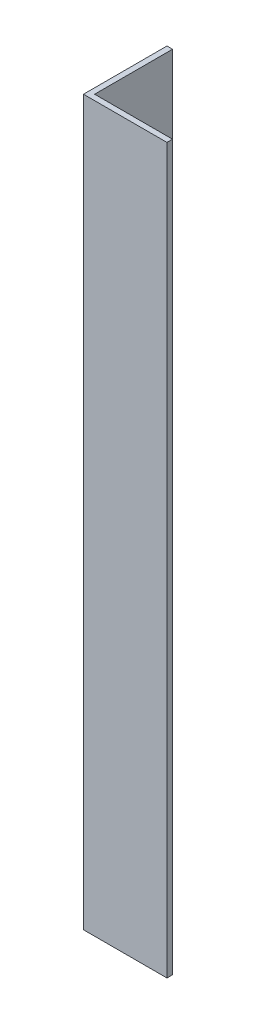
ISO-10303-21;
HEADER;
FILE_DESCRIPTION(('STEP AP214'),'2;1');
FILE_NAME('part.step','',(''),(''),'','','');
FILE_SCHEMA(('AUTOMOTIVE_DESIGN { 1 0 10303 214 1 1 1 1 }'));
ENDSEC;
DATA;
#1=APPLICATION_CONTEXT('core data for automotive mechanical design processes');
#2=APPLICATION_PROTOCOL_DEFINITION('international standard','automotive_design',2000,#1);
#3=PRODUCT_CONTEXT('',#1,'mechanical');
#4=PRODUCT('Part','Part','',(#3));
#5=PRODUCT_RELATED_PRODUCT_CATEGORY('part','',(#4));
#6=PRODUCT_DEFINITION_FORMATION('','',#4);
#7=PRODUCT_DEFINITION_CONTEXT('part definition',#1,'design');
#8=PRODUCT_DEFINITION('design','',#6,#7);
#9=PRODUCT_DEFINITION_SHAPE('','',#8);
#10=(LENGTH_UNIT() NAMED_UNIT(*) SI_UNIT(.MILLI.,.METRE.));
#11=(NAMED_UNIT(*) PLANE_ANGLE_UNIT() SI_UNIT($,.RADIAN.));
#12=(NAMED_UNIT(*) SI_UNIT($,.STERADIAN.) SOLID_ANGLE_UNIT());
#13=UNCERTAINTY_MEASURE_WITH_UNIT(LENGTH_MEASURE(1.E-05),#10,'distance_accuracy_value','');
#14=(GEOMETRIC_REPRESENTATION_CONTEXT(3) GLOBAL_UNCERTAINTY_ASSIGNED_CONTEXT((#13)) GLOBAL_UNIT_ASSIGNED_CONTEXT((#10,
#11,#12)) REPRESENTATION_CONTEXT('',''));
#15=CARTESIAN_POINT('',(0.,0.,0.));
#16=DIRECTION('',(0.,0.,1.));
#17=DIRECTION('',(1.,0.,0.));
#18=AXIS2_PLACEMENT_3D('',#15,#16,#17);
#19=CARTESIAN_POINT('',(0.,130.,0.));
#20=DIRECTION('',(0.,0.,1.));
#21=DIRECTION('',(1.,0.,0.));
#22=AXIS2_PLACEMENT_3D('',#19,#20,#21);
#23=PLANE('',#22);
#24=DIRECTION('',(0.,-1.,0.));
#25=VECTOR('',#24,1.);
#26=CARTESIAN_POINT('',(1.,130.,0.));
#27=LINE('',#26,#25);
#28=CARTESIAN_POINT('',(0.999999999999991,130.,0.));
#29=VERTEX_POINT('',#28);
#30=CARTESIAN_POINT('',(0.999999999999984,0.,0.));
#31=VERTEX_POINT('',#30);
#32=EDGE_CURVE('E48',#29,#31,#27,.T.);
#33=ORIENTED_EDGE('',*,*,#32,.F.);
#34=DIRECTION('',(-1.,0.,0.));
#35=VECTOR('',#34,1.);
#36=CARTESIAN_POINT('',(0.,130.,0.));
#37=LINE('',#36,#35);
#38=CARTESIAN_POINT('',(15.,130.,0.));
#39=VERTEX_POINT('',#38);
#40=EDGE_CURVE('E128',#39,#29,#37,.T.);
#41=ORIENTED_EDGE('',*,*,#40,.F.);
#42=DIRECTION('',(0.,-1.,0.));
#43=VECTOR('',#42,1.);
#44=CARTESIAN_POINT('',(15.,130.,0.));
#45=LINE('',#44,#43);
#46=CARTESIAN_POINT('',(15.,0.,0.));
#47=VERTEX_POINT('',#46);
#48=EDGE_CURVE('E130',#39,#47,#45,.T.);
#49=ORIENTED_EDGE('',*,*,#48,.T.);
#50=DIRECTION('',(-1.,0.,0.));
#51=VECTOR('',#50,1.);
#52=CARTESIAN_POINT('',(0.,0.,0.));
#53=LINE('',#52,#51);
#54=EDGE_CURVE('E101',#47,#31,#53,.T.);
#55=ORIENTED_EDGE('',*,*,#54,.T.);
#56=EDGE_LOOP('',(#33,#41,#49,#55));
#57=FACE_BOUND('',#56,.T.);
#58=ADVANCED_FACE('F33',(#57),#23,.F.);
#59=CARTESIAN_POINT('',(0.,130.,0.));
#60=DIRECTION('',(1.,0.,0.));
#61=DIRECTION('',(0.,0.,-1.));
#62=AXIS2_PLACEMENT_3D('',#59,#60,#61);
#63=PLANE('',#62);
#64=DIRECTION('',(0.,0.,1.));
#65=VECTOR('',#64,1.);
#66=CARTESIAN_POINT('',(0.,0.,0.));
#67=LINE('',#66,#65);
#68=CARTESIAN_POINT('',(0.,0.,-14.));
#69=VERTEX_POINT('',#68);
#70=CARTESIAN_POINT('',(0.,0.,1.));
#71=VERTEX_POINT('',#70);
#72=EDGE_CURVE('E124',#69,#71,#67,.T.);
#73=ORIENTED_EDGE('',*,*,#72,.T.);
#74=DIRECTION('',(0.,-1.,0.));
#75=VECTOR('',#74,1.);
#76=CARTESIAN_POINT('',(0.,130.,1.));
#77=LINE('',#76,#75);
#78=CARTESIAN_POINT('',(0.,130.,1.));
#79=VERTEX_POINT('',#78);
#80=EDGE_CURVE('E11',#79,#71,#77,.T.);
#81=ORIENTED_EDGE('',*,*,#80,.F.);
#82=DIRECTION('',(0.,0.,1.));
#83=VECTOR('',#82,1.);
#84=CARTESIAN_POINT('',(0.,130.,0.));
#85=LINE('',#84,#83);
#86=CARTESIAN_POINT('',(0.,130.,-14.));
#87=VERTEX_POINT('',#86);
#88=EDGE_CURVE('E96',#87,#79,#85,.T.);
#89=ORIENTED_EDGE('',*,*,#88,.F.);
#90=DIRECTION('',(0.,1.,0.));
#91=VECTOR('',#90,1.);
#92=CARTESIAN_POINT('',(0.,130.,-14.));
#93=LINE('',#92,#91);
#94=EDGE_CURVE('E100',#69,#87,#93,.T.);
#95=ORIENTED_EDGE('',*,*,#94,.F.);
#96=EDGE_LOOP('',(#73,#81,#89,#95));
#97=FACE_BOUND('',#96,.T.);
#98=ADVANCED_FACE('F35',(#97),#63,.F.);
#99=CARTESIAN_POINT('',(0.,130.,1.));
#100=DIRECTION('',(0.,0.,-1.));
#101=DIRECTION('',(-1.,0.,0.));
#102=AXIS2_PLACEMENT_3D('',#99,#100,#101);
#103=PLANE('',#102);
#104=DIRECTION('',(1.,0.,0.));
#105=VECTOR('',#104,1.);
#106=CARTESIAN_POINT('',(0.,0.,1.));
#107=LINE('',#106,#105);
#108=CARTESIAN_POINT('',(15.,0.,1.));
#109=VERTEX_POINT('',#108);
#110=EDGE_CURVE('E132',#71,#109,#107,.T.);
#111=ORIENTED_EDGE('',*,*,#110,.T.);
#112=DIRECTION('',(0.,-1.,0.));
#113=VECTOR('',#112,1.);
#114=CARTESIAN_POINT('',(15.,130.,1.));
#115=LINE('',#114,#113);
#116=CARTESIAN_POINT('',(15.,130.,1.));
#117=VERTEX_POINT('',#116);
#118=EDGE_CURVE('E41',#117,#109,#115,.T.);
#119=ORIENTED_EDGE('',*,*,#118,.F.);
#120=DIRECTION('',(1.,0.,0.));
#121=VECTOR('',#120,1.);
#122=CARTESIAN_POINT('',(0.,130.,1.));
#123=LINE('',#122,#121);
#124=EDGE_CURVE('E78',#79,#117,#123,.T.);
#125=ORIENTED_EDGE('',*,*,#124,.F.);
#126=ORIENTED_EDGE('',*,*,#80,.T.);
#127=EDGE_LOOP('',(#111,#119,#125,#126));
#128=FACE_BOUND('',#127,.T.);
#129=ADVANCED_FACE('F157',(#128),#103,.F.);
#130=CARTESIAN_POINT('',(15.,130.,0.));
#131=DIRECTION('',(-1.,0.,0.));
#132=DIRECTION('',(0.,0.,1.));
#133=AXIS2_PLACEMENT_3D('',#130,#131,#132);
#134=PLANE('',#133);
#135=DIRECTION('',(0.,0.,-1.));
#136=VECTOR('',#135,1.);
#137=CARTESIAN_POINT('',(15.,0.,0.));
#138=LINE('',#137,#136);
#139=EDGE_CURVE('E73',#109,#47,#138,.T.);
#140=ORIENTED_EDGE('',*,*,#139,.T.);
#141=ORIENTED_EDGE('',*,*,#48,.F.);
#142=DIRECTION('',(0.,0.,-1.));
#143=VECTOR('',#142,1.);
#144=CARTESIAN_POINT('',(15.,130.,0.));
#145=LINE('',#144,#143);
#146=EDGE_CURVE('E56',#117,#39,#145,.T.);
#147=ORIENTED_EDGE('',*,*,#146,.F.);
#148=ORIENTED_EDGE('',*,*,#118,.T.);
#149=EDGE_LOOP('',(#140,#141,#147,#148));
#150=FACE_BOUND('',#149,.T.);
#151=ADVANCED_FACE('F136',(#150),#134,.F.);
#152=CARTESIAN_POINT('',(0.,130.,0.));
#153=DIRECTION('',(0.,1.,0.));
#154=DIRECTION('',(0.,0.,1.));
#155=AXIS2_PLACEMENT_3D('',#152,#153,#154);
#156=PLANE('',#155);
#157=ORIENTED_EDGE('',*,*,#88,.T.);
#158=ORIENTED_EDGE('',*,*,#124,.T.);
#159=ORIENTED_EDGE('',*,*,#146,.T.);
#160=ORIENTED_EDGE('',*,*,#40,.T.);
#161=DIRECTION('',(0.,0.,1.));
#162=VECTOR('',#161,1.);
#163=CARTESIAN_POINT('',(1.,130.,-14.));
#164=LINE('',#163,#162);
#165=CARTESIAN_POINT('',(1.,130.,-14.));
#166=VERTEX_POINT('',#165);
#167=EDGE_CURVE('E107',#166,#29,#164,.T.);
#168=ORIENTED_EDGE('',*,*,#167,.F.);
#169=DIRECTION('',(1.,0.,0.));
#170=VECTOR('',#169,1.);
#171=CARTESIAN_POINT('',(0.,130.,-14.));
#172=LINE('',#171,#170);
#173=EDGE_CURVE('E104',#87,#166,#172,.T.);
#174=ORIENTED_EDGE('',*,*,#173,.F.);
#175=EDGE_LOOP('',(#157,#158,#159,#160,#168,#174));
#176=FACE_BOUND('',#175,.T.);
#177=ADVANCED_FACE('F105',(#176),#156,.T.);
#178=CARTESIAN_POINT('',(0.,0.,0.));
#179=DIRECTION('',(0.,1.,0.));
#180=DIRECTION('',(0.,0.,1.));
#181=AXIS2_PLACEMENT_3D('',#178,#179,#180);
#182=PLANE('',#181);
#183=ORIENTED_EDGE('',*,*,#72,.F.);
#184=DIRECTION('',(-1.,0.,0.));
#185=VECTOR('',#184,1.);
#186=CARTESIAN_POINT('',(0.,0.,-14.));
#187=LINE('',#186,#185);
#188=CARTESIAN_POINT('',(0.999999999999984,0.,-14.));
#189=VERTEX_POINT('',#188);
#190=EDGE_CURVE('E115',#189,#69,#187,.T.);
#191=ORIENTED_EDGE('',*,*,#190,.F.);
#192=DIRECTION('',(0.,0.,1.));
#193=VECTOR('',#192,1.);
#194=CARTESIAN_POINT('',(0.999999999999984,0.,-14.));
#195=LINE('',#194,#193);
#196=EDGE_CURVE('E120',#189,#31,#195,.T.);
#197=ORIENTED_EDGE('',*,*,#196,.T.);
#198=ORIENTED_EDGE('',*,*,#54,.F.);
#199=ORIENTED_EDGE('',*,*,#139,.F.);
#200=ORIENTED_EDGE('',*,*,#110,.F.);
#201=EDGE_LOOP('',(#183,#191,#197,#198,#199,#200));
#202=FACE_BOUND('',#201,.T.);
#203=ADVANCED_FACE('F139',(#202),#182,.F.);
#204=CARTESIAN_POINT('',(1.,130.,-14.));
#205=DIRECTION('',(-1.,0.,0.));
#206=DIRECTION('',(0.,-1.,0.));
#207=AXIS2_PLACEMENT_3D('',#204,#205,#206);
#208=PLANE('',#207);
#209=ORIENTED_EDGE('',*,*,#32,.T.);
#210=ORIENTED_EDGE('',*,*,#196,.F.);
#211=DIRECTION('',(0.,-1.,0.));
#212=VECTOR('',#211,1.);
#213=CARTESIAN_POINT('',(1.,130.,-14.));
#214=LINE('',#213,#212);
#215=EDGE_CURVE('E110',#166,#189,#214,.T.);
#216=ORIENTED_EDGE('',*,*,#215,.F.);
#217=ORIENTED_EDGE('',*,*,#167,.T.);
#218=EDGE_LOOP('',(#209,#210,#216,#217));
#219=FACE_BOUND('',#218,.T.);
#220=ADVANCED_FACE('F142',(#219),#208,.F.);
#221=CARTESIAN_POINT('',(0.,0.,-14.));
#222=DIRECTION('',(0.,0.,1.));
#223=DIRECTION('',(1.,0.,0.));
#224=AXIS2_PLACEMENT_3D('',#221,#222,#223);
#225=PLANE('',#224);
#226=ORIENTED_EDGE('',*,*,#94,.T.);
#227=ORIENTED_EDGE('',*,*,#173,.T.);
#228=ORIENTED_EDGE('',*,*,#215,.T.);
#229=ORIENTED_EDGE('',*,*,#190,.T.);
#230=EDGE_LOOP('',(#226,#227,#228,#229));
#231=FACE_BOUND('',#230,.T.);
#232=ADVANCED_FACE('F113',(#231),#225,.F.);
#233=CLOSED_SHELL('',(#58,#98,#129,#151,#177,#203,#220,#232));
#234=MANIFOLD_SOLID_BREP('B2',#233);
#235=ADVANCED_BREP_SHAPE_REPRESENTATION('',(#18,#234),#14);
#236=SHAPE_DEFINITION_REPRESENTATION(#9,#235);
ENDSEC;
END-ISO-10303-21;
